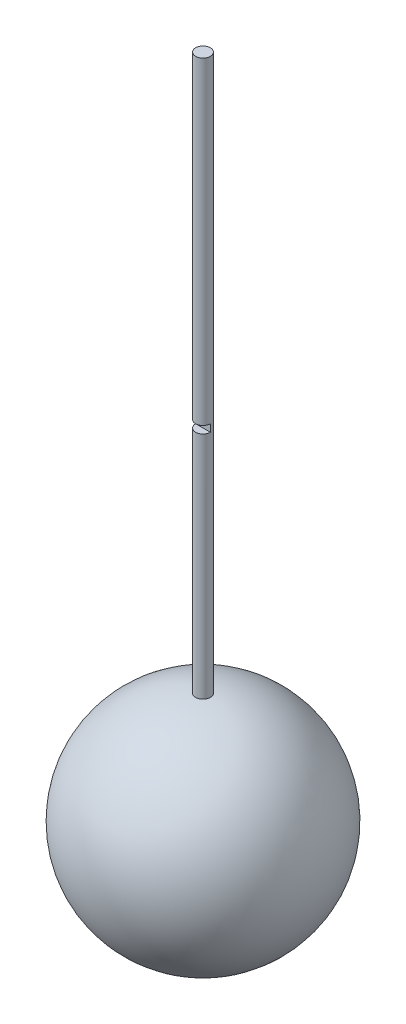
ISO-10303-21;
HEADER;
FILE_DESCRIPTION(('STEP AP214'),'2;1');
FILE_NAME('part.step','',(''),(''),'','','');
FILE_SCHEMA(('AUTOMOTIVE_DESIGN { 1 0 10303 214 1 1 1 1 }'));
ENDSEC;
DATA;
#1=APPLICATION_CONTEXT('core data for automotive mechanical design processes');
#2=APPLICATION_PROTOCOL_DEFINITION('international standard','automotive_design',2000,#1);
#3=PRODUCT_CONTEXT('',#1,'mechanical');
#4=PRODUCT('Part','Part','',(#3));
#5=PRODUCT_RELATED_PRODUCT_CATEGORY('part','',(#4));
#6=PRODUCT_DEFINITION_FORMATION('','',#4);
#7=PRODUCT_DEFINITION_CONTEXT('part definition',#1,'design');
#8=PRODUCT_DEFINITION('design','',#6,#7);
#9=PRODUCT_DEFINITION_SHAPE('','',#8);
#10=(LENGTH_UNIT() NAMED_UNIT(*) SI_UNIT(.MILLI.,.METRE.));
#11=(NAMED_UNIT(*) PLANE_ANGLE_UNIT() SI_UNIT($,.RADIAN.));
#12=(NAMED_UNIT(*) SI_UNIT($,.STERADIAN.) SOLID_ANGLE_UNIT());
#13=UNCERTAINTY_MEASURE_WITH_UNIT(LENGTH_MEASURE(1.E-05),#10,'distance_accuracy_value','');
#14=(GEOMETRIC_REPRESENTATION_CONTEXT(3) GLOBAL_UNCERTAINTY_ASSIGNED_CONTEXT((#13)) GLOBAL_UNIT_ASSIGNED_CONTEXT((#10,
#11,#12)) REPRESENTATION_CONTEXT('',''));
#15=CARTESIAN_POINT('',(0.,0.,0.));
#16=DIRECTION('',(0.,0.,1.));
#17=DIRECTION('',(1.,0.,0.));
#18=AXIS2_PLACEMENT_3D('',#15,#16,#17);
#19=CARTESIAN_POINT('',(0.,90.,0.));
#20=DIRECTION('',(0.,-1.,0.));
#21=DIRECTION('',(0.,0.,-1.));
#22=AXIS2_PLACEMENT_3D('',#19,#20,#21);
#23=CYLINDRICAL_SURFACE('',#22,1.);
#24=CARTESIAN_POINT('',(0.,90.,0.));
#25=DIRECTION('',(0.,1.,0.));
#26=DIRECTION('',(0.,0.,1.));
#27=AXIS2_PLACEMENT_3D('',#24,#25,#26);
#28=CIRCLE('',#27,1.);
#29=CARTESIAN_POINT('',(0.,90.,1.));
#30=VERTEX_POINT('',#29);
#31=EDGE_CURVE('E83',#30,#30,#28,.T.);
#32=ORIENTED_EDGE('',*,*,#31,.F.);
#33=EDGE_LOOP('',(#32));
#34=FACE_BOUND('',#33,.T.);
#35=CARTESIAN_POINT('',(0.,14.9666295470958,0.));
#36=DIRECTION('',(0.,-1.,0.));
#37=DIRECTION('',(0.,0.,-1.));
#38=AXIS2_PLACEMENT_3D('',#35,#36,#37);
#39=CIRCLE('',#38,1.);
#40=CARTESIAN_POINT('',(0.,14.9666295470958,-1.));
#41=VERTEX_POINT('',#40);
#42=EDGE_CURVE('E72',#41,#41,#39,.T.);
#43=ORIENTED_EDGE('',*,*,#42,.F.);
#44=EDGE_LOOP('',(#43));
#45=FACE_BOUND('',#44,.T.);
#46=CARTESIAN_POINT('',(0.,46.,0.));
#47=DIRECTION('',(0.,1.,0.));
#48=DIRECTION('',(0.,0.,1.));
#49=AXIS2_PLACEMENT_3D('',#46,#47,#48);
#50=CIRCLE('',#49,1.);
#51=CARTESIAN_POINT('',(-0.999999999999999,46.,0.));
#52=VERTEX_POINT('',#51);
#53=CARTESIAN_POINT('',(0.999999999999999,46.,0.));
#54=VERTEX_POINT('',#53);
#55=EDGE_CURVE('E11',#52,#54,#50,.T.);
#56=ORIENTED_EDGE('',*,*,#55,.F.);
#57=DIRECTION('',(0.,-1.,0.));
#58=VECTOR('',#57,1.);
#59=CARTESIAN_POINT('',(-1.,90.,0.));
#60=LINE('',#59,#58);
#61=CARTESIAN_POINT('',(-1.,47.,0.));
#62=VERTEX_POINT('',#61);
#63=EDGE_CURVE('E49',#62,#52,#60,.T.);
#64=ORIENTED_EDGE('',*,*,#63,.F.);
#65=CARTESIAN_POINT('',(0.,47.,0.));
#66=DIRECTION('',(0.,-1.,0.));
#67=DIRECTION('',(0.,0.,-1.));
#68=AXIS2_PLACEMENT_3D('',#65,#66,#67);
#69=CIRCLE('',#68,1.);
#70=CARTESIAN_POINT('',(1.,47.,0.));
#71=VERTEX_POINT('',#70);
#72=EDGE_CURVE('E67',#71,#62,#69,.T.);
#73=ORIENTED_EDGE('',*,*,#72,.F.);
#74=DIRECTION('',(0.,-1.,0.));
#75=VECTOR('',#74,1.);
#76=CARTESIAN_POINT('',(1.,90.,0.));
#77=LINE('',#76,#75);
#78=EDGE_CURVE('E71',#54,#71,#77,.F.);
#79=ORIENTED_EDGE('',*,*,#78,.F.);
#80=EDGE_LOOP('',(#56,#64,#73,#79));
#81=FACE_BOUND('',#80,.T.);
#82=ADVANCED_FACE('F40',(#34,#45,#81),#23,.T.);
#83=CARTESIAN_POINT('',(0.,90.,0.));
#84=DIRECTION('',(0.,1.,0.));
#85=DIRECTION('',(0.,0.,1.));
#86=AXIS2_PLACEMENT_3D('',#83,#84,#85);
#87=PLANE('',#86);
#88=ORIENTED_EDGE('',*,*,#31,.T.);
#89=EDGE_LOOP('',(#88));
#90=FACE_BOUND('',#89,.T.);
#91=ADVANCED_FACE('F101',(#90),#87,.T.);
#92=CARTESIAN_POINT('',(0.,0.,0.));
#93=DIRECTION('',(0.,1.,0.));
#94=DIRECTION('',(1.,0.,0.));
#95=AXIS2_PLACEMENT_3D('',#92,#93,#94);
#96=SPHERICAL_SURFACE('',#95,15.);
#97=ORIENTED_EDGE('',*,*,#42,.T.);
#98=EDGE_LOOP('',(#97));
#99=FACE_BOUND('',#98,.T.);
#100=ADVANCED_FACE('F42',(#99),#96,.T.);
#101=CARTESIAN_POINT('',(10.,46.,0.));
#102=DIRECTION('',(0.,1.,0.));
#103=DIRECTION('',(0.,0.,1.));
#104=AXIS2_PLACEMENT_3D('',#101,#102,#103);
#105=PLANE('',#104);
#106=ORIENTED_EDGE('',*,*,#55,.T.);
#107=DIRECTION('',(-1.,0.,0.));
#108=VECTOR('',#107,1.);
#109=CARTESIAN_POINT('',(10.,46.,0.));
#110=LINE('',#109,#108);
#111=EDGE_CURVE('E75',#54,#52,#110,.T.);
#112=ORIENTED_EDGE('',*,*,#111,.T.);
#113=EDGE_LOOP('',(#106,#112));
#114=FACE_BOUND('',#113,.T.);
#115=ADVANCED_FACE('F92',(#114),#105,.T.);
#116=CARTESIAN_POINT('',(10.,47.,0.));
#117=DIRECTION('',(0.,0.,1.));
#118=DIRECTION('',(0.,-1.,0.));
#119=AXIS2_PLACEMENT_3D('',#116,#117,#118);
#120=PLANE('',#119);
#121=ORIENTED_EDGE('',*,*,#63,.T.);
#122=ORIENTED_EDGE('',*,*,#111,.F.);
#123=ORIENTED_EDGE('',*,*,#78,.T.);
#124=DIRECTION('',(-1.,0.,0.));
#125=VECTOR('',#124,1.);
#126=CARTESIAN_POINT('',(10.,47.,0.));
#127=LINE('',#126,#125);
#128=EDGE_CURVE('E55',#71,#62,#127,.T.);
#129=ORIENTED_EDGE('',*,*,#128,.T.);
#130=EDGE_LOOP('',(#121,#122,#123,#129));
#131=FACE_BOUND('',#130,.T.);
#132=ADVANCED_FACE('F74',(#131),#120,.T.);
#133=CARTESIAN_POINT('',(10.,47.,4.13973944621659));
#134=DIRECTION('',(0.,-1.,0.));
#135=DIRECTION('',(0.,0.,-1.));
#136=AXIS2_PLACEMENT_3D('',#133,#134,#135);
#137=PLANE('',#136);
#138=ORIENTED_EDGE('',*,*,#72,.T.);
#139=ORIENTED_EDGE('',*,*,#128,.F.);
#140=EDGE_LOOP('',(#138,#139));
#141=FACE_BOUND('',#140,.T.);
#142=ADVANCED_FACE('F68',(#141),#137,.T.);
#143=CLOSED_SHELL('',(#82,#91,#100,#115,#132,#142));
#144=CARTESIAN_POINT('',(0.,0.,0.));
#145=DIRECTION('',(0.,1.,0.));
#146=DIRECTION('',(-1.,0.,0.));
#147=AXIS2_PLACEMENT_3D('',#144,#145,#146);
#148=SPHERICAL_SURFACE('',#147,13.2921191783931);
#149=CARTESIAN_POINT('',(0.,13.2544495265781,0.));
#150=DIRECTION('',(0.,-1.,0.));
#151=DIRECTION('',(0.,0.,-1.));
#152=AXIS2_PLACEMENT_3D('',#149,#150,#151);
#153=CIRCLE('',#152,1.);
#154=CARTESIAN_POINT('',(0.,13.2544495265781,-1.));
#155=VERTEX_POINT('',#154);
#156=EDGE_CURVE('E80',#155,#155,#153,.F.);
#157=ORIENTED_EDGE('',*,*,#156,.T.);
#158=EDGE_LOOP('',(#157));
#159=FACE_BOUND('',#158,.T.);
#160=ADVANCED_FACE('F121',(#159),#148,.F.);
#161=CARTESIAN_POINT('',(0.,0.,0.));
#162=DIRECTION('',(0.,1.,0.));
#163=DIRECTION('',(0.,0.,1.));
#164=AXIS2_PLACEMENT_3D('',#161,#162,#163);
#165=PLANE('',#164);
#166=CARTESIAN_POINT('',(0.,0.,0.));
#167=DIRECTION('',(0.,1.,0.));
#168=DIRECTION('',(0.,0.,1.));
#169=AXIS2_PLACEMENT_3D('',#166,#167,#168);
#170=CIRCLE('',#169,1.);
#171=CARTESIAN_POINT('',(0.,0.,-1.));
#172=VERTEX_POINT('',#171);
#173=EDGE_CURVE('E86',#172,#172,#170,.T.);
#174=ORIENTED_EDGE('',*,*,#173,.F.);
#175=EDGE_LOOP('',(#174));
#176=FACE_BOUND('',#175,.T.);
#177=ADVANCED_FACE('F115',(#176),#165,.F.);
#178=CARTESIAN_POINT('',(0.,13.2544495265781,-1.));
#179=CARTESIAN_POINT('',(0.,13.1163823440096,-1.));
#180=CARTESIAN_POINT('',(0.,12.9783151614411,-1.));
#181=CARTESIAN_POINT('',(0.,12.702180796304,-1.));
#182=CARTESIAN_POINT('',(0.,12.5641136137355,-1.));
#183=CARTESIAN_POINT('',(0.,12.2879792485985,-1.));
#184=CARTESIAN_POINT('',(0.,12.1499120660299,-1.));
#185=CARTESIAN_POINT('',(0.,11.8737777008929,-1.));
#186=CARTESIAN_POINT('',(0.,11.7357105183244,-1.));
#187=CARTESIAN_POINT('',(0.,11.4595761531873,-1.));
#188=CARTESIAN_POINT('',(0.,11.3215089706188,-1.));
#189=CARTESIAN_POINT('',(0.,11.0453746054818,-1.));
#190=CARTESIAN_POINT('',(0.,10.9073074229133,-1.));
#191=CARTESIAN_POINT('',(0.,10.6311730577762,-1.));
#192=CARTESIAN_POINT('',(0.,10.4931058752077,-1.));
#193=CARTESIAN_POINT('',(0.,10.2169715100706,-1.));
#194=CARTESIAN_POINT('',(0.,10.0789043275021,-1.));
#195=CARTESIAN_POINT('',(0.,9.80276996236507,-1.));
#196=CARTESIAN_POINT('',(0.,9.66470277979654,-1.));
#197=CARTESIAN_POINT('',(0.,9.3885684146595,-1.));
#198=CARTESIAN_POINT('',(0.,9.25050123209098,-1.));
#199=CARTESIAN_POINT('',(0.,8.97436686695394,-1.));
#200=CARTESIAN_POINT('',(0.,8.83629968438541,-1.));
#201=CARTESIAN_POINT('',(0.,8.56016531924837,-1.));
#202=CARTESIAN_POINT('',(0.,8.42209813667985,-1.));
#203=CARTESIAN_POINT('',(0.,8.14596377154281,-1.));
#204=CARTESIAN_POINT('',(0.,8.00789658897429,-1.));
#205=CARTESIAN_POINT('',(0.,7.73176222383724,-1.));
#206=CARTESIAN_POINT('',(0.,7.59369504126871,-1.));
#207=CARTESIAN_POINT('',(0.,7.31756067613167,-1.));
#208=CARTESIAN_POINT('',(0.,7.17949349356314,-1.));
#209=CARTESIAN_POINT('',(0.,6.9033591284261,-1.));
#210=CARTESIAN_POINT('',(0.,6.76529194585758,-1.));
#211=CARTESIAN_POINT('',(0.,6.48915758072054,-1.));
#212=CARTESIAN_POINT('',(0.,6.35109039815202,-1.));
#213=CARTESIAN_POINT('',(0.,6.07495603301497,-1.));
#214=CARTESIAN_POINT('',(0.,5.93688885044645,-1.));
#215=CARTESIAN_POINT('',(0.,5.66075448530941,-1.));
#216=CARTESIAN_POINT('',(0.,5.52268730274089,-1.));
#217=CARTESIAN_POINT('',(0.,5.24655293760384,-1.));
#218=CARTESIAN_POINT('',(0.,5.10848575503531,-1.));
#219=CARTESIAN_POINT('',(0.,4.83235138989826,-1.));
#220=CARTESIAN_POINT('',(0.,4.69428420732974,-1.));
#221=CARTESIAN_POINT('',(0.,4.4181498421927,-1.));
#222=CARTESIAN_POINT('',(0.,4.28008265962418,-1.));
#223=CARTESIAN_POINT('',(0.,4.00394829448714,-1.));
#224=CARTESIAN_POINT('',(0.,3.86588111191861,-1.));
#225=CARTESIAN_POINT('',(0.,3.58974674678157,-1.));
#226=CARTESIAN_POINT('',(0.,3.45167956421305,-1.));
#227=CARTESIAN_POINT('',(0.,3.175545199076,-1.));
#228=CARTESIAN_POINT('',(0.,3.03747801650748,-1.));
#229=CARTESIAN_POINT('',(0.,2.76134365137043,-1.));
#230=CARTESIAN_POINT('',(0.,2.62327646880191,-1.));
#231=CARTESIAN_POINT('',(0.,2.34714210366486,-1.));
#232=CARTESIAN_POINT('',(0.,2.20907492109634,-1.));
#233=CARTESIAN_POINT('',(0.,1.9329405559593,-1.));
#234=CARTESIAN_POINT('',(0.,1.79487337339078,-1.));
#235=CARTESIAN_POINT('',(0.,1.51873900825374,-1.));
#236=CARTESIAN_POINT('',(0.,1.38067182568521,-1.));
#237=CARTESIAN_POINT('',(0.,1.10453746054817,-1.));
#238=CARTESIAN_POINT('',(0.,0.966470277979641,-1.));
#239=CARTESIAN_POINT('',(0.,0.690335912842593,-1.));
#240=CARTESIAN_POINT('',(0.,0.552268730274072,-1.));
#241=CARTESIAN_POINT('',(0.,0.276134365137029,-1.));
#242=CARTESIAN_POINT('',(0.,0.138067182568508,-1.));
#243=CARTESIAN_POINT('',(0.,0.,-1.));
#244=B_SPLINE_CURVE_WITH_KNOTS('',3,(#178,#179,#180,#181,#182,#183,#184,#185,#186,#187,#188,
#189,#190,#191,#192,#193,#194,#195,#196,#197,#198,#199,#200,#201,#202,#203,#204,#205,#206,#207,
#208,#209,#210,#211,#212,#213,#214,#215,#216,#217,#218,#219,#220,#221,#222,#223,#224,#225,#226,
#227,#228,#229,#230,#231,#232,#233,#234,#235,#236,#237,#238,#239,#240,#241,#242,#243),
.UNSPECIFIED.,.F.,.F.,(4,2,2,2,2,2,2,2,2,2,2,2,2,2,2,2,2,2,2,2,2,2,2,2,2,2,2,2,2,2,2,2,4),(0.,
0.414201547705564,0.828403095411129,1.24260464311671,1.65680619082227,2.07100773852784,
2.4852092862334,2.89941083393896,3.31361238164454,3.72781392935011,4.14201547705567,
4.55621702476124,4.9704185724668,5.38462012017236,5.79882166787794,6.21302321558351,
6.62722476328907,7.04142631099464,7.4556278587002,7.86982940640577,8.28403095411134,
8.69823250181691,9.11243404952247,9.52663559722804,9.9408371449336,10.3550386926392,
10.7692402403447,11.1834417880503,11.5976433357559,12.0118448834614,12.426046431167,
12.8402479788726,13.2544495265781),.UNSPECIFIED.);
#245=EDGE_CURVE('BSEAM106',#155,#172,#244,.T.);
#246=ORIENTED_EDGE('',*,*,#156,.F.);
#247=ORIENTED_EDGE('',*,*,#173,.T.);
#248=ORIENTED_EDGE('',*,*,#245,.T.);
#249=ORIENTED_EDGE('',*,*,#245,.F.);
#250=EDGE_LOOP('',(#246,#248,#247,#249));
#251=FACE_BOUND('',#250,.T.);
#252=ADVANCED_FACE('F106',(#251),#23,.T.);
#253=CLOSED_SHELL('',(#160,#177,#252));
#254=ORIENTED_CLOSED_SHELL('',*,#253,.T.);
#255=BREP_WITH_VOIDS('B2',#143,(#254));
#256=ADVANCED_BREP_SHAPE_REPRESENTATION('',(#18,#255),#14);
#257=SHAPE_DEFINITION_REPRESENTATION(#9,#256);
ENDSEC;
END-ISO-10303-21;
